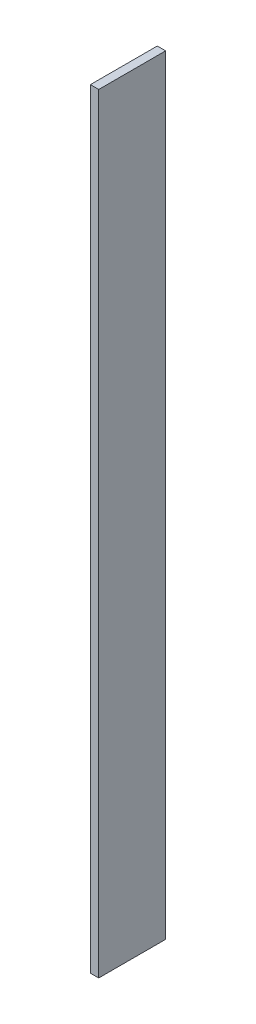
ISO-10303-21;
HEADER;
FILE_DESCRIPTION(('STEP AP214'),'2;1');
FILE_NAME('part.step','',(''),(''),'','','');
FILE_SCHEMA(('AUTOMOTIVE_DESIGN { 1 0 10303 214 1 1 1 1 }'));
ENDSEC;
DATA;
#1=APPLICATION_CONTEXT('core data for automotive mechanical design processes');
#2=APPLICATION_PROTOCOL_DEFINITION('international standard','automotive_design',2000,#1);
#3=PRODUCT_CONTEXT('',#1,'mechanical');
#4=PRODUCT('Part','Part','',(#3));
#5=PRODUCT_RELATED_PRODUCT_CATEGORY('part','',(#4));
#6=PRODUCT_DEFINITION_FORMATION('','',#4);
#7=PRODUCT_DEFINITION_CONTEXT('part definition',#1,'design');
#8=PRODUCT_DEFINITION('design','',#6,#7);
#9=PRODUCT_DEFINITION_SHAPE('','',#8);
#10=(LENGTH_UNIT() NAMED_UNIT(*) SI_UNIT(.MILLI.,.METRE.));
#11=(NAMED_UNIT(*) PLANE_ANGLE_UNIT() SI_UNIT($,.RADIAN.));
#12=(NAMED_UNIT(*) SI_UNIT($,.STERADIAN.) SOLID_ANGLE_UNIT());
#13=UNCERTAINTY_MEASURE_WITH_UNIT(LENGTH_MEASURE(1.E-05),#10,'distance_accuracy_value','');
#14=(GEOMETRIC_REPRESENTATION_CONTEXT(3) GLOBAL_UNCERTAINTY_ASSIGNED_CONTEXT((#13)) GLOBAL_UNIT_ASSIGNED_CONTEXT((#10,
#11,#12)) REPRESENTATION_CONTEXT('',''));
#15=CARTESIAN_POINT('',(0.,0.,0.));
#16=DIRECTION('',(0.,0.,1.));
#17=DIRECTION('',(1.,0.,0.));
#18=AXIS2_PLACEMENT_3D('',#15,#16,#17);
#19=CARTESIAN_POINT('',(-0.25,23.,2.));
#20=DIRECTION('',(1.,0.,0.));
#21=DIRECTION('',(0.,0.,-1.));
#22=AXIS2_PLACEMENT_3D('',#19,#20,#21);
#23=PLANE('',#22);
#24=DIRECTION('',(0.,0.,1.));
#25=VECTOR('',#24,1.);
#26=CARTESIAN_POINT('',(-0.25,-23.,2.));
#27=LINE('',#26,#25);
#28=CARTESIAN_POINT('',(-0.25,-23.,-2.));
#29=VERTEX_POINT('',#28);
#30=CARTESIAN_POINT('',(-0.25,-23.,2.));
#31=VERTEX_POINT('',#30);
#32=EDGE_CURVE('E98',#29,#31,#27,.T.);
#33=ORIENTED_EDGE('',*,*,#32,.T.);
#34=DIRECTION('',(0.,-1.,0.));
#35=VECTOR('',#34,1.);
#36=CARTESIAN_POINT('',(-0.25,23.,2.));
#37=LINE('',#36,#35);
#38=CARTESIAN_POINT('',(-0.25,23.,2.));
#39=VERTEX_POINT('',#38);
#40=EDGE_CURVE('E11',#39,#31,#37,.T.);
#41=ORIENTED_EDGE('',*,*,#40,.F.);
#42=DIRECTION('',(0.,0.,1.));
#43=VECTOR('',#42,1.);
#44=CARTESIAN_POINT('',(-0.25,23.,2.));
#45=LINE('',#44,#43);
#46=CARTESIAN_POINT('',(-0.25,23.,-2.));
#47=VERTEX_POINT('',#46);
#48=EDGE_CURVE('E86',#47,#39,#45,.T.);
#49=ORIENTED_EDGE('',*,*,#48,.F.);
#50=DIRECTION('',(0.,-1.,0.));
#51=VECTOR('',#50,1.);
#52=CARTESIAN_POINT('',(-0.25,23.,-2.));
#53=LINE('',#52,#51);
#54=EDGE_CURVE('E94',#47,#29,#53,.T.);
#55=ORIENTED_EDGE('',*,*,#54,.T.);
#56=EDGE_LOOP('',(#33,#41,#49,#55));
#57=FACE_BOUND('',#56,.T.);
#58=ADVANCED_FACE('F35',(#57),#23,.F.);
#59=CARTESIAN_POINT('',(0.25,23.,2.));
#60=DIRECTION('',(0.,0.,-1.));
#61=DIRECTION('',(-1.,0.,0.));
#62=AXIS2_PLACEMENT_3D('',#59,#60,#61);
#63=PLANE('',#62);
#64=DIRECTION('',(1.,0.,0.));
#65=VECTOR('',#64,1.);
#66=CARTESIAN_POINT('',(0.25,-23.,2.));
#67=LINE('',#66,#65);
#68=CARTESIAN_POINT('',(0.25,-23.,2.));
#69=VERTEX_POINT('',#68);
#70=EDGE_CURVE('E90',#31,#69,#67,.T.);
#71=ORIENTED_EDGE('',*,*,#70,.T.);
#72=DIRECTION('',(0.,-1.,0.));
#73=VECTOR('',#72,1.);
#74=CARTESIAN_POINT('',(0.25,23.,2.));
#75=LINE('',#74,#73);
#76=CARTESIAN_POINT('',(0.25,23.,2.));
#77=VERTEX_POINT('',#76);
#78=EDGE_CURVE('E43',#77,#69,#75,.T.);
#79=ORIENTED_EDGE('',*,*,#78,.F.);
#80=DIRECTION('',(1.,0.,0.));
#81=VECTOR('',#80,1.);
#82=CARTESIAN_POINT('',(0.25,23.,2.));
#83=LINE('',#82,#81);
#84=EDGE_CURVE('E81',#39,#77,#83,.T.);
#85=ORIENTED_EDGE('',*,*,#84,.F.);
#86=ORIENTED_EDGE('',*,*,#40,.T.);
#87=EDGE_LOOP('',(#71,#79,#85,#86));
#88=FACE_BOUND('',#87,.T.);
#89=ADVANCED_FACE('F89',(#88),#63,.F.);
#90=CARTESIAN_POINT('',(0.25,23.,2.));
#91=DIRECTION('',(-1.,0.,0.));
#92=DIRECTION('',(0.,0.,1.));
#93=AXIS2_PLACEMENT_3D('',#90,#91,#92);
#94=PLANE('',#93);
#95=DIRECTION('',(0.,0.,-1.));
#96=VECTOR('',#95,1.);
#97=CARTESIAN_POINT('',(0.25,-23.,2.));
#98=LINE('',#97,#96);
#99=CARTESIAN_POINT('',(0.25,-23.,-2.));
#100=VERTEX_POINT('',#99);
#101=EDGE_CURVE('E68',#69,#100,#98,.T.);
#102=ORIENTED_EDGE('',*,*,#101,.T.);
#103=DIRECTION('',(0.,-1.,0.));
#104=VECTOR('',#103,1.);
#105=CARTESIAN_POINT('',(0.25,23.,-2.));
#106=LINE('',#105,#104);
#107=CARTESIAN_POINT('',(0.25,23.,-2.));
#108=VERTEX_POINT('',#107);
#109=EDGE_CURVE('E91',#108,#100,#106,.T.);
#110=ORIENTED_EDGE('',*,*,#109,.F.);
#111=DIRECTION('',(0.,0.,-1.));
#112=VECTOR('',#111,1.);
#113=CARTESIAN_POINT('',(0.25,23.,2.));
#114=LINE('',#113,#112);
#115=EDGE_CURVE('E84',#77,#108,#114,.T.);
#116=ORIENTED_EDGE('',*,*,#115,.F.);
#117=ORIENTED_EDGE('',*,*,#78,.T.);
#118=EDGE_LOOP('',(#102,#110,#116,#117));
#119=FACE_BOUND('',#118,.T.);
#120=ADVANCED_FACE('F92',(#119),#94,.F.);
#121=CARTESIAN_POINT('',(0.25,23.,-2.));
#122=DIRECTION('',(0.,0.,1.));
#123=DIRECTION('',(1.,0.,0.));
#124=AXIS2_PLACEMENT_3D('',#121,#122,#123);
#125=PLANE('',#124);
#126=DIRECTION('',(-1.,0.,0.));
#127=VECTOR('',#126,1.);
#128=CARTESIAN_POINT('',(0.25,-23.,-2.));
#129=LINE('',#128,#127);
#130=EDGE_CURVE('E74',#100,#29,#129,.T.);
#131=ORIENTED_EDGE('',*,*,#130,.T.);
#132=ORIENTED_EDGE('',*,*,#54,.F.);
#133=DIRECTION('',(-1.,0.,0.));
#134=VECTOR('',#133,1.);
#135=CARTESIAN_POINT('',(0.25,23.,-2.));
#136=LINE('',#135,#134);
#137=EDGE_CURVE('E51',#108,#47,#136,.T.);
#138=ORIENTED_EDGE('',*,*,#137,.F.);
#139=ORIENTED_EDGE('',*,*,#109,.T.);
#140=EDGE_LOOP('',(#131,#132,#138,#139));
#141=FACE_BOUND('',#140,.T.);
#142=ADVANCED_FACE('F105',(#141),#125,.F.);
#143=CARTESIAN_POINT('',(0.,23.,0.));
#144=DIRECTION('',(0.,1.,0.));
#145=DIRECTION('',(0.,0.,1.));
#146=AXIS2_PLACEMENT_3D('',#143,#144,#145);
#147=PLANE('',#146);
#148=ORIENTED_EDGE('',*,*,#48,.T.);
#149=ORIENTED_EDGE('',*,*,#84,.T.);
#150=ORIENTED_EDGE('',*,*,#115,.T.);
#151=ORIENTED_EDGE('',*,*,#137,.T.);
#152=EDGE_LOOP('',(#148,#149,#150,#151));
#153=FACE_BOUND('',#152,.T.);
#154=ADVANCED_FACE('F82',(#153),#147,.T.);
#155=CARTESIAN_POINT('',(0.,-23.,0.));
#156=DIRECTION('',(0.,1.,0.));
#157=DIRECTION('',(0.,0.,1.));
#158=AXIS2_PLACEMENT_3D('',#155,#156,#157);
#159=PLANE('',#158);
#160=ORIENTED_EDGE('',*,*,#32,.F.);
#161=ORIENTED_EDGE('',*,*,#130,.F.);
#162=ORIENTED_EDGE('',*,*,#101,.F.);
#163=ORIENTED_EDGE('',*,*,#70,.F.);
#164=EDGE_LOOP('',(#160,#161,#162,#163));
#165=FACE_BOUND('',#164,.T.);
#166=ADVANCED_FACE('F108',(#165),#159,.F.);
#167=CLOSED_SHELL('',(#58,#89,#120,#142,#154,#166));
#168=MANIFOLD_SOLID_BREP('B2',#167);
#169=ADVANCED_BREP_SHAPE_REPRESENTATION('',(#18,#168),#14);
#170=SHAPE_DEFINITION_REPRESENTATION(#9,#169);
ENDSEC;
END-ISO-10303-21;
